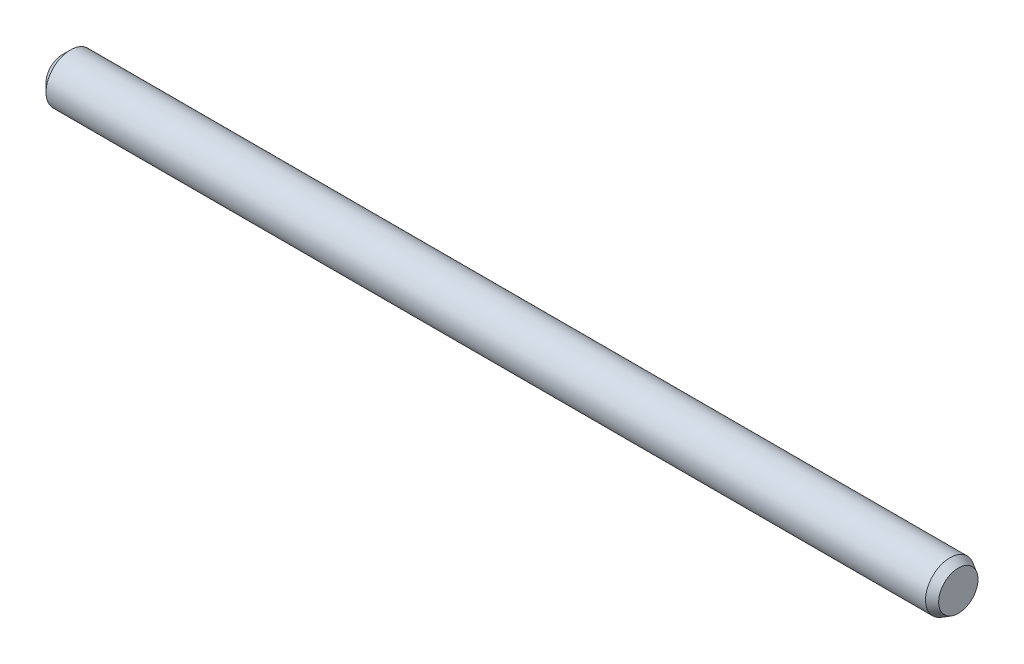
ISO-10303-21;
HEADER;
FILE_DESCRIPTION(('STEP AP214'),'2;1');
FILE_NAME('part.step','',(''),(''),'','','');
FILE_SCHEMA(('AUTOMOTIVE_DESIGN { 1 0 10303 214 1 1 1 1 }'));
ENDSEC;
DATA;
#1=APPLICATION_CONTEXT('core data for automotive mechanical design processes');
#2=APPLICATION_PROTOCOL_DEFINITION('international standard','automotive_design',2000,#1);
#3=PRODUCT_CONTEXT('',#1,'mechanical');
#4=PRODUCT('Part','Part','',(#3));
#5=PRODUCT_RELATED_PRODUCT_CATEGORY('part','',(#4));
#6=PRODUCT_DEFINITION_FORMATION('','',#4);
#7=PRODUCT_DEFINITION_CONTEXT('part definition',#1,'design');
#8=PRODUCT_DEFINITION('design','',#6,#7);
#9=PRODUCT_DEFINITION_SHAPE('','',#8);
#10=(LENGTH_UNIT() NAMED_UNIT(*) SI_UNIT(.MILLI.,.METRE.));
#11=(NAMED_UNIT(*) PLANE_ANGLE_UNIT() SI_UNIT($,.RADIAN.));
#12=(NAMED_UNIT(*) SI_UNIT($,.STERADIAN.) SOLID_ANGLE_UNIT());
#13=UNCERTAINTY_MEASURE_WITH_UNIT(LENGTH_MEASURE(1.E-05),#10,'distance_accuracy_value','');
#14=(GEOMETRIC_REPRESENTATION_CONTEXT(3) GLOBAL_UNCERTAINTY_ASSIGNED_CONTEXT((#13)) GLOBAL_UNIT_ASSIGNED_CONTEXT((#10,
#11,#12)) REPRESENTATION_CONTEXT('',''));
#15=CARTESIAN_POINT('',(0.,0.,0.));
#16=DIRECTION('',(0.,0.,1.));
#17=DIRECTION('',(1.,0.,0.));
#18=AXIS2_PLACEMENT_3D('',#15,#16,#17);
#19=CARTESIAN_POINT('',(54.,0.,0.));
#20=DIRECTION('',(-1.,0.,0.));
#21=DIRECTION('',(0.,0.,1.));
#22=AXIS2_PLACEMENT_3D('',#19,#20,#21);
#23=CYLINDRICAL_SURFACE('',#22,1.475);
#24=CARTESIAN_POINT('',(0.500000000000007,0.,0.));
#25=DIRECTION('',(1.,0.,0.));
#26=DIRECTION('',(0.,0.,-1.));
#27=AXIS2_PLACEMENT_3D('',#24,#25,#26);
#28=CIRCLE('',#27,1.475);
#29=CARTESIAN_POINT('',(0.500000000000007,0.,-1.475));
#30=VERTEX_POINT('',#29);
#31=EDGE_CURVE('E39',#30,#30,#28,.T.);
#32=ORIENTED_EDGE('',*,*,#31,.T.);
#33=EDGE_LOOP('',(#32));
#34=FACE_BOUND('',#33,.T.);
#35=CARTESIAN_POINT('',(53.5,0.,0.));
#36=DIRECTION('',(1.,0.,0.));
#37=DIRECTION('',(0.,0.,-1.));
#38=AXIS2_PLACEMENT_3D('',#35,#36,#37);
#39=CIRCLE('',#38,1.475);
#40=CARTESIAN_POINT('',(53.5,0.,-1.475));
#41=VERTEX_POINT('',#40);
#42=EDGE_CURVE('E43',#41,#41,#39,.F.);
#43=ORIENTED_EDGE('',*,*,#42,.T.);
#44=EDGE_LOOP('',(#43));
#45=FACE_BOUND('',#44,.T.);
#46=ADVANCED_FACE('F32',(#34,#45),#23,.T.);
#47=CARTESIAN_POINT('',(54.,0.,0.));
#48=DIRECTION('',(1.,0.,0.));
#49=DIRECTION('',(0.,0.,-1.));
#50=AXIS2_PLACEMENT_3D('',#47,#48,#49);
#51=PLANE('',#50);
#52=CARTESIAN_POINT('',(54.,0.,0.));
#53=DIRECTION('',(1.,0.,0.));
#54=DIRECTION('',(0.,0.,-1.));
#55=AXIS2_PLACEMENT_3D('',#52,#53,#54);
#56=CIRCLE('',#55,1.18632486540518);
#57=CARTESIAN_POINT('',(54.,0.,-1.18632486540518));
#58=VERTEX_POINT('',#57);
#59=EDGE_CURVE('E47',#58,#58,#56,.T.);
#60=ORIENTED_EDGE('',*,*,#59,.T.);
#61=EDGE_LOOP('',(#60));
#62=FACE_BOUND('',#61,.T.);
#63=ADVANCED_FACE('F53',(#62),#51,.T.);
#64=CARTESIAN_POINT('',(0.,0.,0.));
#65=DIRECTION('',(1.,0.,0.));
#66=DIRECTION('',(0.,0.,-1.));
#67=AXIS2_PLACEMENT_3D('',#64,#65,#66);
#68=PLANE('',#67);
#69=CARTESIAN_POINT('',(0.,0.,0.));
#70=DIRECTION('',(1.,0.,0.));
#71=DIRECTION('',(0.,0.,-1.));
#72=AXIS2_PLACEMENT_3D('',#69,#70,#71);
#73=CIRCLE('',#72,0.97499999999999);
#74=CARTESIAN_POINT('',(0.,0.,-0.97499999999999));
#75=VERTEX_POINT('',#74);
#76=EDGE_CURVE('E10',#75,#75,#73,.F.);
#77=ORIENTED_EDGE('',*,*,#76,.T.);
#78=EDGE_LOOP('',(#77));
#79=FACE_BOUND('',#78,.T.);
#80=ADVANCED_FACE('F57',(#79),#68,.F.);
#81=CARTESIAN_POINT('',(54.,0.,0.));
#82=DIRECTION('',(-1.,0.,0.));
#83=DIRECTION('',(0.,0.,1.));
#84=AXIS2_PLACEMENT_3D('',#81,#82,#83);
#85=CONICAL_SURFACE('',#84,1.18632486540518,0.523598775598292);
#86=ORIENTED_EDGE('',*,*,#42,.F.);
#87=EDGE_LOOP('',(#86));
#88=FACE_BOUND('',#87,.T.);
#89=ORIENTED_EDGE('',*,*,#59,.F.);
#90=EDGE_LOOP('',(#89));
#91=FACE_BOUND('',#90,.T.);
#92=ADVANCED_FACE('F55',(#88,#91),#85,.T.);
#93=CARTESIAN_POINT('',(0.500000000000007,0.,0.));
#94=DIRECTION('',(1.,0.,0.));
#95=DIRECTION('',(0.,0.,-1.));
#96=AXIS2_PLACEMENT_3D('',#93,#94,#95);
#97=CONICAL_SURFACE('',#96,1.475,0.785398163397452);
#98=ORIENTED_EDGE('',*,*,#76,.F.);
#99=EDGE_LOOP('',(#98));
#100=FACE_BOUND('',#99,.T.);
#101=ORIENTED_EDGE('',*,*,#31,.F.);
#102=EDGE_LOOP('',(#101));
#103=FACE_BOUND('',#102,.T.);
#104=ADVANCED_FACE('F34',(#100,#103),#97,.T.);
#105=CLOSED_SHELL('',(#46,#63,#80,#92,#104));
#106=MANIFOLD_SOLID_BREP('B2',#105);
#107=ADVANCED_BREP_SHAPE_REPRESENTATION('',(#18,#106),#14);
#108=SHAPE_DEFINITION_REPRESENTATION(#9,#107);
ENDSEC;
END-ISO-10303-21;
